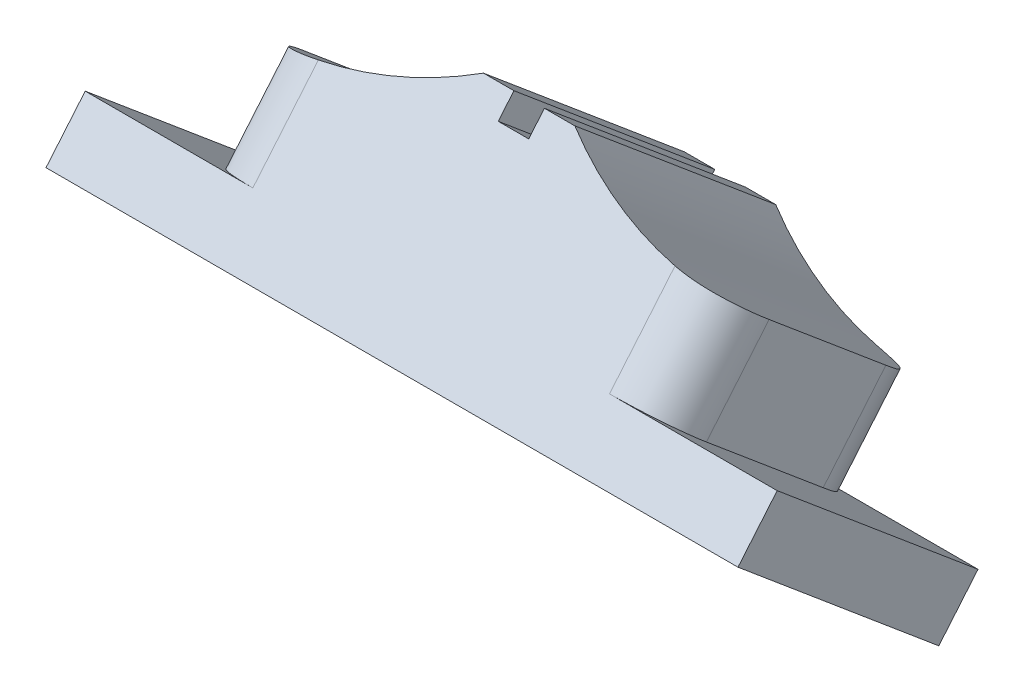
ISO-10303-21;
HEADER;
FILE_DESCRIPTION(('STEP AP214'),'2;1');
FILE_NAME('part.step','',(''),(''),'','','');
FILE_SCHEMA(('AUTOMOTIVE_DESIGN { 1 0 10303 214 1 1 1 1 }'));
ENDSEC;
DATA;
#1=APPLICATION_CONTEXT('core data for automotive mechanical design processes');
#2=APPLICATION_PROTOCOL_DEFINITION('international standard','automotive_design',2000,#1);
#3=PRODUCT_CONTEXT('',#1,'mechanical');
#4=PRODUCT('Part','Part','',(#3));
#5=PRODUCT_RELATED_PRODUCT_CATEGORY('part','',(#4));
#6=PRODUCT_DEFINITION_FORMATION('','',#4);
#7=PRODUCT_DEFINITION_CONTEXT('part definition',#1,'design');
#8=PRODUCT_DEFINITION('design','',#6,#7);
#9=PRODUCT_DEFINITION_SHAPE('','',#8);
#10=(LENGTH_UNIT() NAMED_UNIT(*) SI_UNIT(.MILLI.,.METRE.));
#11=(NAMED_UNIT(*) PLANE_ANGLE_UNIT() SI_UNIT($,.RADIAN.));
#12=(NAMED_UNIT(*) SI_UNIT($,.STERADIAN.) SOLID_ANGLE_UNIT());
#13=UNCERTAINTY_MEASURE_WITH_UNIT(LENGTH_MEASURE(1.E-05),#10,'distance_accuracy_value','');
#14=(GEOMETRIC_REPRESENTATION_CONTEXT(3) GLOBAL_UNCERTAINTY_ASSIGNED_CONTEXT((#13)) GLOBAL_UNIT_ASSIGNED_CONTEXT((#10,
#11,#12)) REPRESENTATION_CONTEXT('',''));
#15=CARTESIAN_POINT('',(0.,0.,0.));
#16=DIRECTION('',(0.,0.,1.));
#17=DIRECTION('',(1.,0.,0.));
#18=AXIS2_PLACEMENT_3D('',#15,#16,#17);
#19=CARTESIAN_POINT('',(27.,-212.433524015321,-13.4302925179041));
#20=DIRECTION('',(0.,-0.766044443118977,0.64278760968654));
#21=DIRECTION('',(0.,-0.64278760968654,-0.766044443118977));
#22=AXIS2_PLACEMENT_3D('',#19,#20,#21);
#23=PLANE('',#22);
#24=DIRECTION('',(0.,-0.642787609686541,-0.766044443118977));
#25=VECTOR('',#24,1.);
#26=CARTESIAN_POINT('',(-0.25,-217.403424112797,-19.3531888139056));
#27=LINE('',#26,#25);
#28=CARTESIAN_POINT('',(-0.25,-219.619001888255,-21.9936115874796));
#29=VERTEX_POINT('',#28);
#30=CARTESIAN_POINT('',(-0.25,-225.146975331559,-28.5815937983029));
#31=VERTEX_POINT('',#30);
#32=EDGE_CURVE('E63',#29,#31,#27,.T.);
#33=ORIENTED_EDGE('',*,*,#32,.F.);
#34=DIRECTION('',(-1.,0.,0.));
#35=VECTOR('',#34,1.);
#36=CARTESIAN_POINT('',(7.1,-219.619001888255,-21.9936115874797));
#37=LINE('',#36,#35);
#38=CARTESIAN_POINT('',(0.749999999999999,-219.619001888255,-21.9936115874796));
#39=VERTEX_POINT('',#38);
#40=EDGE_CURVE('E362',#39,#29,#37,.T.);
#41=ORIENTED_EDGE('',*,*,#40,.F.);
#42=DIRECTION('',(0.,-0.642787609686541,-0.766044443118977));
#43=VECTOR('',#42,1.);
#44=CARTESIAN_POINT('',(0.75,-217.403424112797,-19.3531888139056));
#45=LINE('',#44,#43);
#46=CARTESIAN_POINT('',(0.75,-225.146975331559,-28.5815937983029));
#47=VERTEX_POINT('',#46);
#48=EDGE_CURVE('E238',#39,#47,#45,.T.);
#49=ORIENTED_EDGE('',*,*,#48,.T.);
#50=DIRECTION('',(1.,0.,0.));
#51=VECTOR('',#50,1.);
#52=CARTESIAN_POINT('',(7.1,-225.146975331559,-28.5815937983029));
#53=LINE('',#52,#51);
#54=EDGE_CURVE('E358',#31,#47,#53,.T.);
#55=ORIENTED_EDGE('',*,*,#54,.F.);
#56=EDGE_LOOP('',(#33,#41,#49,#55));
#57=FACE_BOUND('',#56,.T.);
#58=ADVANCED_FACE('F39',(#57),#23,.F.);
#59=CARTESIAN_POINT('',(7.1,-203.875751952295,-35.2037668022753));
#60=DIRECTION('',(0.,-0.642787609686541,-0.766044443118977));
#61=DIRECTION('',(0.,0.766044443118977,-0.642787609686541));
#62=AXIS2_PLACEMENT_3D('',#59,#60,#61);
#63=PLANE('',#62);
#64=CARTESIAN_POINT('',(-6.4,-212.260187456543,-28.168390063031));
#65=DIRECTION('',(0.,-0.642787609686541,-0.766044443118977));
#66=DIRECTION('',(0.,0.766044443118977,-0.642787609686541));
#67=AXIS2_PLACEMENT_3D('',#64,#65,#66);
#68=CIRCLE('',#67,11.40625);
#69=CARTESIAN_POINT('',(-4.6,-220.888396650371,-20.9284629107698));
#70=VERTEX_POINT('',#69);
#71=EDGE_CURVE('E405',#70,#29,#68,.F.);
#72=ORIENTED_EDGE('',*,*,#71,.F.);
#73=DIRECTION('',(0.,-0.766044443118977,0.642787609686541));
#74=VECTOR('',#73,1.);
#75=CARTESIAN_POINT('',(-4.6,-203.875751952295,-35.2037668022753));
#76=LINE('',#75,#74);
#77=CARTESIAN_POINT('',(-4.6,-223.44922410385,-18.7796735390474));
#78=VERTEX_POINT('',#77);
#79=EDGE_CURVE('E388',#70,#78,#76,.T.);
#80=ORIENTED_EDGE('',*,*,#79,.T.);
#81=DIRECTION('',(-1.,0.,0.));
#82=VECTOR('',#81,1.);
#83=CARTESIAN_POINT('',(12.6,-223.44922410385,-18.7796735390474));
#84=LINE('',#83,#82);
#85=CARTESIAN_POINT('',(-10.1,-223.44922410385,-18.7796735390474));
#86=VERTEX_POINT('',#85);
#87=EDGE_CURVE('E423',#78,#86,#84,.T.);
#88=ORIENTED_EDGE('',*,*,#87,.T.);
#89=DIRECTION('',(0.,0.766044443118977,-0.642787609686541));
#90=VECTOR('',#89,1.);
#91=CARTESIAN_POINT('',(-10.1,-224.981312990088,-17.4940983196743));
#92=LINE('',#91,#90);
#93=CARTESIAN_POINT('',(-10.1,-224.981312990088,-17.4940983196743));
#94=VERTEX_POINT('',#93);
#95=EDGE_CURVE('E470',#94,#86,#92,.T.);
#96=ORIENTED_EDGE('',*,*,#95,.F.);
#97=DIRECTION('',(-1.,0.,0.));
#98=VECTOR('',#97,1.);
#99=CARTESIAN_POINT('',(12.6,-224.981312990088,-17.4940983196743));
#100=LINE('',#99,#98);
#101=CARTESIAN_POINT('',(12.6,-224.981312990088,-17.4940983196743));
#102=VERTEX_POINT('',#101);
#103=EDGE_CURVE('E483',#102,#94,#100,.T.);
#104=ORIENTED_EDGE('',*,*,#103,.F.);
#105=DIRECTION('',(0.,0.766044443118977,-0.642787609686541));
#106=VECTOR('',#105,1.);
#107=CARTESIAN_POINT('',(12.6,-224.981312990088,-17.4940983196743));
#108=LINE('',#107,#106);
#109=CARTESIAN_POINT('',(12.6,-223.44922410385,-18.7796735390474));
#110=VERTEX_POINT('',#109);
#111=EDGE_CURVE('E366',#102,#110,#108,.T.);
#112=ORIENTED_EDGE('',*,*,#111,.T.);
#113=CARTESIAN_POINT('',(7.1,-223.44922410385,-18.7796735390474));
#114=VERTEX_POINT('',#113);
#115=EDGE_CURVE('E449',#110,#114,#84,.T.);
#116=ORIENTED_EDGE('',*,*,#115,.T.);
#117=DIRECTION('',(0.,-0.766044443118977,0.642787609686541));
#118=VECTOR('',#117,1.);
#119=CARTESIAN_POINT('',(7.1,-203.875751952295,-35.2037668022753));
#120=LINE('',#119,#118);
#121=CARTESIAN_POINT('',(7.1,-220.888396650371,-20.9284629107698));
#122=VERTEX_POINT('',#121);
#123=EDGE_CURVE('E386',#122,#114,#120,.T.);
#124=ORIENTED_EDGE('',*,*,#123,.F.);
#125=CARTESIAN_POINT('',(8.9,-212.260187456543,-28.168390063031));
#126=DIRECTION('',(0.,-0.642787609686541,-0.766044443118977));
#127=DIRECTION('',(0.,0.766044443118977,-0.642787609686541));
#128=AXIS2_PLACEMENT_3D('',#125,#126,#127);
#129=CIRCLE('',#128,11.40625);
#130=CARTESIAN_POINT('',(2.75,-219.619001888255,-21.9936115874797));
#131=VERTEX_POINT('',#130);
#132=EDGE_CURVE('E310',#122,#131,#129,.T.);
#133=ORIENTED_EDGE('',*,*,#132,.T.);
#134=CARTESIAN_POINT('',(1.75,-219.619001888255,-21.9936115874797));
#135=VERTEX_POINT('',#134);
#136=EDGE_CURVE('E359',#131,#135,#37,.T.);
#137=ORIENTED_EDGE('',*,*,#136,.T.);
#138=DIRECTION('',(0.,-0.766044443118977,0.642787609686541));
#139=VECTOR('',#138,1.);
#140=CARTESIAN_POINT('',(1.75,-203.875751952295,-35.2037668022753));
#141=LINE('',#140,#139);
#142=CARTESIAN_POINT('',(1.75,-220.23183744275,-21.4793814997304));
#143=VERTEX_POINT('',#142);
#144=EDGE_CURVE('E309',#135,#143,#141,.T.);
#145=ORIENTED_EDGE('',*,*,#144,.T.);
#146=DIRECTION('',(-1.,0.,0.));
#147=VECTOR('',#146,1.);
#148=CARTESIAN_POINT('',(7.1,-220.23183744275,-21.4793814997304));
#149=LINE('',#148,#147);
#150=CARTESIAN_POINT('',(0.749999999999999,-220.23183744275,-21.4793814997304));
#151=VERTEX_POINT('',#150);
#152=EDGE_CURVE('E487',#143,#151,#149,.T.);
#153=ORIENTED_EDGE('',*,*,#152,.T.);
#154=DIRECTION('',(0.,-0.766044443118977,0.642787609686541));
#155=VECTOR('',#154,1.);
#156=CARTESIAN_POINT('',(0.750000000000004,-203.875751952295,-35.2037668022753));
#157=LINE('',#156,#155);
#158=EDGE_CURVE('E236',#39,#151,#157,.T.);
#159=ORIENTED_EDGE('',*,*,#158,.F.);
#160=ORIENTED_EDGE('',*,*,#40,.T.);
#161=EDGE_LOOP('',(#72,#80,#88,#96,#104,#112,#116,#124,#133,#137,#145,#153,#159,#160));
#162=FACE_BOUND('',#161,.T.);
#163=ADVANCED_FACE('F328',(#162),#63,.F.);
#164=CARTESIAN_POINT('',(-4.6,-205.032769649731,-36.5826467998895));
#165=DIRECTION('',(0.,-0.766044443118977,0.642787609686541));
#166=DIRECTION('',(0.,-0.642787609686541,-0.766044443118977));
#167=AXIS2_PLACEMENT_3D('',#164,#165,#166);
#168=CYLINDRICAL_SURFACE('',#167,1.79999999999999);
#169=CARTESIAN_POINT('',(-6.39999999999999,-222.154899583305,-22.215473887658));
#170=CARTESIAN_POINT('',(-6.39999966162086,-222.122353709626,-22.1766902455585));
#171=CARTESIAN_POINT('',(-6.39786248934707,-222.089826566027,-22.1379225460177));
#172=CARTESIAN_POINT('',(-6.38933642219922,-222.02499850881,-22.0606697423791));
#173=CARTESIAN_POINT('',(-6.38294772680934,-221.99269758465,-22.0221846251079));
#174=CARTESIAN_POINT('',(-6.35746428264791,-221.896515770289,-21.907646470184));
#175=CARTESIAN_POINT('',(-6.33205201265783,-221.833250102125,-21.832384462603));
#176=CARTESIAN_POINT('',(-6.26508538130227,-221.710034567167,-21.6864701803497));
#177=CARTESIAN_POINT('',(-6.22352305103209,-221.650086354011,-21.6158202015174));
#178=CARTESIAN_POINT('',(-6.12544362686748,-221.534819656705,-21.4814693955804));
#179=CARTESIAN_POINT('',(-6.06892911062745,-221.47950037672,-21.4177673733662));
#180=CARTESIAN_POINT('',(-5.94263351426813,-221.37464149739,-21.2995984206337));
#181=CARTESIAN_POINT('',(-5.87286642515245,-221.325095890874,-21.2451218643136));
#182=CARTESIAN_POINT('',(-5.72204315844291,-221.232601873031,-21.1473060252902));
#183=CARTESIAN_POINT('',(-5.6409859507835,-221.189654064413,-21.103967759828));
#184=CARTESIAN_POINT('',(-5.47034903749162,-221.111245972975,-21.0302344794521));
#185=CARTESIAN_POINT('',(-5.3808063809634,-221.075755135881,-20.9997861069426));
#186=CARTESIAN_POINT('',(-5.19555154878798,-221.012589728072,-20.952738623383));
#187=CARTESIAN_POINT('',(-5.0998419449059,-220.984911924717,-20.9361337790046));
#188=CARTESIAN_POINT('',(-4.93632166219124,-220.945330285694,-20.9203656894631));
#189=CARTESIAN_POINT('',(-4.86938464779866,-220.931213025648,-20.9173213344002));
#190=CARTESIAN_POINT('',(-4.73493889953039,-220.906876662016,-20.9179043263069));
#191=CARTESIAN_POINT('',(-4.66743118949004,-220.896651665,-20.9215215378582));
#192=CARTESIAN_POINT('',(-4.6,-220.888396650371,-20.9284629107698));
#193=B_SPLINE_CURVE_WITH_KNOTS('',3,(#169,#170,#171,#172,#173,#174,#175,#176,#177,#178,#179,
#180,#181,#182,#183,#184,#185,#186,#187,#188,#189,#190,#191,#192),.UNSPECIFIED.,.F.,.F.,(4,2,2,
2,2,2,2,2,2,2,2,4),(0.,0.151796967185068,0.303586812461919,0.606678939947741,0.909920812115097,
1.21311044148627,1.51598174883098,1.81888070707245,2.12051325798589,2.42202082495577,
2.62704003185086,2.83174756447131),.UNSPECIFIED.);
#194=CARTESIAN_POINT('',(-6.4,-222.154899583305,-22.215473887658));
#195=VERTEX_POINT('',#194);
#196=EDGE_CURVE('E253',#195,#70,#193,.T.);
#197=ORIENTED_EDGE('',*,*,#196,.F.);
#198=DIRECTION('',(0.,-0.766044443118977,0.642787609686541));
#199=VECTOR('',#198,1.);
#200=CARTESIAN_POINT('',(-6.4,-205.032769649731,-36.5826467998895));
#201=LINE('',#200,#199);
#202=CARTESIAN_POINT('',(-6.4,-224.606241801286,-20.1585535366612));
#203=VERTEX_POINT('',#202);
#204=EDGE_CURVE('E390',#195,#203,#201,.T.);
#205=ORIENTED_EDGE('',*,*,#204,.T.);
#206=CARTESIAN_POINT('',(-4.6,-224.606241801286,-20.1585535366612));
#207=DIRECTION('',(0.,0.766044443118977,-0.642787609686541));
#208=DIRECTION('',(0.,0.642787609686541,0.766044443118977));
#209=AXIS2_PLACEMENT_3D('',#206,#207,#208);
#210=CIRCLE('',#209,1.79999999999999);
#211=EDGE_CURVE('E383',#203,#78,#210,.T.);
#212=ORIENTED_EDGE('',*,*,#211,.T.);
#213=ORIENTED_EDGE('',*,*,#79,.F.);
#214=EDGE_LOOP('',(#197,#205,#212,#213));
#215=FACE_BOUND('',#214,.T.);
#216=ADVANCED_FACE('F336',(#215),#168,.T.);
#217=CARTESIAN_POINT('',(-6.4,-208.246707698164,-40.4128690154845));
#218=DIRECTION('',(1.,0.,0.));
#219=DIRECTION('',(0.,0.,-1.));
#220=AXIS2_PLACEMENT_3D('',#217,#218,#219);
#221=PLANE('',#220);
#222=DIRECTION('',(0.,-0.642787609686541,-0.766044443118977));
#223=VECTOR('',#222,1.);
#224=CARTESIAN_POINT('',(-6.4,-218.782304110411,-18.1961711164699));
#225=LINE('',#224,#223);
#226=CARTESIAN_POINT('',(-6.4,-225.368837631738,-26.045696103253));
#227=VERTEX_POINT('',#226);
#228=EDGE_CURVE('E233',#195,#227,#225,.T.);
#229=ORIENTED_EDGE('',*,*,#228,.T.);
#230=DIRECTION('',(0.,-0.766044443118977,0.642787609686541));
#231=VECTOR('',#230,1.);
#232=CARTESIAN_POINT('',(-6.39999999999999,-208.246707698164,-40.4128690154845));
#233=LINE('',#232,#231);
#234=CARTESIAN_POINT('',(-6.39999999999999,-227.820179849718,-23.9887757522562));
#235=VERTEX_POINT('',#234);
#236=EDGE_CURVE('E392',#227,#235,#233,.T.);
#237=ORIENTED_EDGE('',*,*,#236,.T.);
#238=DIRECTION('',(0.,0.642787609686542,0.766044443118976));
#239=VECTOR('',#238,1.);
#240=CARTESIAN_POINT('',(-6.4,-227.820179849718,-23.9887757522562));
#241=LINE('',#240,#239);
#242=EDGE_CURVE('E380',#235,#203,#241,.T.);
#243=ORIENTED_EDGE('',*,*,#242,.T.);
#244=ORIENTED_EDGE('',*,*,#204,.F.);
#245=EDGE_LOOP('',(#229,#237,#243,#244));
#246=FACE_BOUND('',#245,.T.);
#247=ADVANCED_FACE('F417',(#246),#221,.F.);
#248=CARTESIAN_POINT('',(-4.6,-208.246707698164,-40.4128690154845));
#249=DIRECTION('',(0.,-0.766044443118977,0.642787609686541));
#250=DIRECTION('',(0.,-0.642787609686541,-0.766044443118977));
#251=AXIS2_PLACEMENT_3D('',#248,#249,#250);
#252=CYLINDRICAL_SURFACE('',#251,1.79999999999999);
#253=CARTESIAN_POINT('',(-4.6,-226.416370093675,-27.516445121593));
#254=CARTESIAN_POINT('',(-4.64994826080426,-226.422486052998,-27.5113128102879));
#255=CARTESIAN_POINT('',(-4.69992818860471,-226.42700484587,-27.5048056339949));
#256=CARTESIAN_POINT('',(-4.79964525844471,-226.432822165645,-27.4890565767436));
#257=CARTESIAN_POINT('',(-4.84938239260366,-226.434120588704,-27.4798146076112));
#258=CARTESIAN_POINT('',(-4.99761875118883,-226.433146926838,-27.4480411449811));
#259=CARTESIAN_POINT('',(-5.09529300113693,-226.426024203381,-27.4214467612742));
#260=CARTESIAN_POINT('',(-5.28541952564419,-226.399139247986,-27.3578555956856));
#261=CARTESIAN_POINT('',(-5.3778671704631,-226.379365995345,-27.3208497594708));
#262=CARTESIAN_POINT('',(-5.5547340172246,-226.328070358171,-27.2371181658142));
#263=CARTESIAN_POINT('',(-5.63915564856285,-226.296551543208,-27.1903953633398));
#264=CARTESIAN_POINT('',(-5.79696732163634,-226.223362685721,-27.0884711713953));
#265=CARTESIAN_POINT('',(-5.87042528313845,-226.18175972535,-27.0333266667633));
#266=CARTESIAN_POINT('',(-6.00486217275486,-226.089968725154,-26.9154479425604));
#267=CARTESIAN_POINT('',(-6.06583805102167,-226.039778592643,-26.8527118740257));
#268=CARTESIAN_POINT('',(-6.17370815572414,-225.932578944369,-26.7208294690174));
#269=CARTESIAN_POINT('',(-6.22056058967509,-225.875549874274,-26.6516648849517));
#270=CARTESIAN_POINT('',(-6.29860056915496,-225.756831632501,-26.5086861327525));
#271=CARTESIAN_POINT('',(-6.32979633281895,-225.695144925205,-26.4348744268256));
#272=CARTESIAN_POINT('',(-6.36843264545957,-225.589064888362,-26.308203737747));
#273=CARTESIAN_POINT('',(-6.38026134891348,-225.545348492658,-26.2560727405979));
#274=CARTESIAN_POINT('',(-6.39604536779249,-225.457369050863,-26.151203692914));
#275=CARTESIAN_POINT('',(-6.40001100057624,-225.413106797889,-26.0984665293119));
#276=CARTESIAN_POINT('',(-6.39999999999999,-225.368837631738,-26.045696103253));
#277=B_SPLINE_CURVE_WITH_KNOTS('',3,(#253,#254,#255,#256,#257,#258,#259,#260,#261,#262,#263,
#264,#265,#266,#267,#268,#269,#270,#271,#272,#273,#274,#275,#276),.UNSPECIFIED.,.F.,.F.,(4,2,2,
2,2,2,2,2,2,2,2,4),(0.,0.15165762873199,0.303320147680413,0.606195069857615,0.909334206121151,
1.21238129103091,1.51346524181524,1.81462267127661,2.11666269584407,2.41854401434521,
2.62528397403094,2.83175248434783),.UNSPECIFIED.);
#278=CARTESIAN_POINT('',(-4.6,-226.416370093675,-27.5164451215931));
#279=VERTEX_POINT('',#278);
#280=EDGE_CURVE('E245',#279,#227,#277,.T.);
#281=ORIENTED_EDGE('',*,*,#280,.F.);
#282=DIRECTION('',(0.,-0.766044443118977,0.642787609686541));
#283=VECTOR('',#282,1.);
#284=CARTESIAN_POINT('',(-4.6,-209.4037253956,-41.7917490130986));
#285=LINE('',#284,#283);
#286=CARTESIAN_POINT('',(-4.6,-228.977197547154,-25.3676557498701));
#287=VERTEX_POINT('',#286);
#288=EDGE_CURVE('E394',#279,#287,#285,.T.);
#289=ORIENTED_EDGE('',*,*,#288,.T.);
#290=CARTESIAN_POINT('',(-4.6,-227.820179849718,-23.9887757522562));
#291=DIRECTION('',(0.,0.766044443118977,-0.642787609686541));
#292=DIRECTION('',(0.,0.642787609686541,0.766044443118977));
#293=AXIS2_PLACEMENT_3D('',#290,#291,#292);
#294=CIRCLE('',#293,1.79999999999999);
#295=EDGE_CURVE('E377',#287,#235,#294,.T.);
#296=ORIENTED_EDGE('',*,*,#295,.T.);
#297=ORIENTED_EDGE('',*,*,#236,.F.);
#298=EDGE_LOOP('',(#281,#289,#296,#297));
#299=FACE_BOUND('',#298,.T.);
#300=ADVANCED_FACE('F260',(#299),#252,.T.);
#301=CARTESIAN_POINT('',(7.1,-209.4037253956,-41.7917490130986));
#302=DIRECTION('',(0.,0.642787609686541,0.766044443118977));
#303=DIRECTION('',(0.,-0.766044443118977,0.642787609686541));
#304=AXIS2_PLACEMENT_3D('',#301,#302,#303);
#305=PLANE('',#304);
#306=CARTESIAN_POINT('',(-6.4,-217.788160899848,-34.7563722738543));
#307=DIRECTION('',(0.,0.642787609686541,0.766044443118977));
#308=DIRECTION('',(0.,-0.766044443118977,0.642787609686541));
#309=AXIS2_PLACEMENT_3D('',#306,#307,#308);
#310=CIRCLE('',#309,11.40625);
#311=EDGE_CURVE('E230',#279,#31,#310,.T.);
#312=ORIENTED_EDGE('',*,*,#311,.T.);
#313=ORIENTED_EDGE('',*,*,#54,.T.);
#314=DIRECTION('',(0.,-0.766044443118977,0.64278760968654));
#315=VECTOR('',#314,1.);
#316=CARTESIAN_POINT('',(0.749999999999999,-225.759810886055,-28.0673637105537));
#317=LINE('',#316,#315);
#318=CARTESIAN_POINT('',(0.749999999999999,-225.759810886055,-28.0673637105537));
#319=VERTEX_POINT('',#318);
#320=EDGE_CURVE('E224',#47,#319,#317,.T.);
#321=ORIENTED_EDGE('',*,*,#320,.T.);
#322=DIRECTION('',(-1.,0.,0.));
#323=VECTOR('',#322,1.);
#324=CARTESIAN_POINT('',(1.25,-225.759810886055,-28.0673637105537));
#325=LINE('',#324,#323);
#326=CARTESIAN_POINT('',(1.75,-225.759810886055,-28.0673637105537));
#327=VERTEX_POINT('',#326);
#328=EDGE_CURVE('E432',#327,#319,#325,.T.);
#329=ORIENTED_EDGE('',*,*,#328,.F.);
#330=DIRECTION('',(0.,-0.766044443118977,0.64278760968654));
#331=VECTOR('',#330,1.);
#332=CARTESIAN_POINT('',(1.75,-225.759810886055,-28.0673637105537));
#333=LINE('',#332,#331);
#334=CARTESIAN_POINT('',(1.75,-225.146975331559,-28.5815937983029));
#335=VERTEX_POINT('',#334);
#336=EDGE_CURVE('E427',#335,#327,#333,.T.);
#337=ORIENTED_EDGE('',*,*,#336,.F.);
#338=CARTESIAN_POINT('',(2.74999999999993,-225.146975331559,-28.5815937983029));
#339=VERTEX_POINT('',#338);
#340=EDGE_CURVE('E352',#335,#339,#53,.T.);
#341=ORIENTED_EDGE('',*,*,#340,.T.);
#342=CARTESIAN_POINT('',(8.9,-217.788160899848,-34.7563722738543));
#343=DIRECTION('',(0.,-0.642787609686541,-0.766044443118977));
#344=DIRECTION('',(0.,-0.766044443118977,0.642787609686541));
#345=AXIS2_PLACEMENT_3D('',#342,#343,#344);
#346=CIRCLE('',#345,11.40625);
#347=CARTESIAN_POINT('',(7.1,-226.416370093675,-27.5164451215931));
#348=VERTEX_POINT('',#347);
#349=EDGE_CURVE('E426',#348,#339,#346,.T.);
#350=ORIENTED_EDGE('',*,*,#349,.F.);
#351=DIRECTION('',(0.,-0.766044443118977,0.642787609686541));
#352=VECTOR('',#351,1.);
#353=CARTESIAN_POINT('',(7.1,-209.4037253956,-41.7917490130986));
#354=LINE('',#353,#352);
#355=CARTESIAN_POINT('',(7.1,-228.977197547154,-25.3676557498701));
#356=VERTEX_POINT('',#355);
#357=EDGE_CURVE('E396',#348,#356,#354,.T.);
#358=ORIENTED_EDGE('',*,*,#357,.T.);
#359=DIRECTION('',(1.,0.,0.));
#360=VECTOR('',#359,1.);
#361=CARTESIAN_POINT('',(12.6,-228.977197547154,-25.3676557498701));
#362=LINE('',#361,#360);
#363=CARTESIAN_POINT('',(12.6,-228.977197547154,-25.3676557498701));
#364=VERTEX_POINT('',#363);
#365=EDGE_CURVE('E455',#356,#364,#362,.T.);
#366=ORIENTED_EDGE('',*,*,#365,.T.);
#367=DIRECTION('',(0.,0.766044443118977,-0.642787609686541));
#368=VECTOR('',#367,1.);
#369=CARTESIAN_POINT('',(12.6,-230.509286433392,-24.082080530497));
#370=LINE('',#369,#368);
#371=CARTESIAN_POINT('',(12.6,-230.509286433392,-24.082080530497));
#372=VERTEX_POINT('',#371);
#373=EDGE_CURVE('E464',#372,#364,#370,.T.);
#374=ORIENTED_EDGE('',*,*,#373,.F.);
#375=DIRECTION('',(1.,0.,0.));
#376=VECTOR('',#375,1.);
#377=CARTESIAN_POINT('',(12.6,-230.509286433392,-24.082080530497));
#378=LINE('',#377,#376);
#379=CARTESIAN_POINT('',(-10.1,-230.509286433392,-24.082080530497));
#380=VERTEX_POINT('',#379);
#381=EDGE_CURVE('E468',#380,#372,#378,.T.);
#382=ORIENTED_EDGE('',*,*,#381,.F.);
#383=DIRECTION('',(0.,0.766044443118977,-0.642787609686541));
#384=VECTOR('',#383,1.);
#385=CARTESIAN_POINT('',(-10.1,-230.509286433392,-24.082080530497));
#386=LINE('',#385,#384);
#387=CARTESIAN_POINT('',(-10.1,-228.977197547154,-25.3676557498701));
#388=VERTEX_POINT('',#387);
#389=EDGE_CURVE('E467',#380,#388,#386,.T.);
#390=ORIENTED_EDGE('',*,*,#389,.T.);
#391=EDGE_CURVE('E461',#388,#287,#362,.T.);
#392=ORIENTED_EDGE('',*,*,#391,.T.);
#393=ORIENTED_EDGE('',*,*,#288,.F.);
#394=EDGE_LOOP('',(#312,#313,#321,#329,#337,#341,#350,#358,#366,#374,#382,#390,#392,#393));
#395=FACE_BOUND('',#394,.T.);
#396=ADVANCED_FACE('F316',(#395),#305,.F.);
#397=CARTESIAN_POINT('',(7.1,-208.246707698164,-40.4128690154845));
#398=DIRECTION('',(0.,-0.766044443118977,0.642787609686541));
#399=DIRECTION('',(0.,-0.642787609686541,-0.766044443118977));
#400=AXIS2_PLACEMENT_3D('',#397,#398,#399);
#401=CYLINDRICAL_SURFACE('',#400,1.79999999999999);
#402=ORIENTED_EDGE('',*,*,#357,.F.);
#403=CARTESIAN_POINT('',(7.1,-226.416370093675,-27.516445121593));
#404=CARTESIAN_POINT('',(7.14994826080426,-226.422486052998,-27.5113128102879));
#405=CARTESIAN_POINT('',(7.19992818860471,-226.42700484587,-27.5048056339949));
#406=CARTESIAN_POINT('',(7.29964525844471,-226.432822165645,-27.4890565767436));
#407=CARTESIAN_POINT('',(7.34938239260366,-226.434120588704,-27.4798146076112));
#408=CARTESIAN_POINT('',(7.49761875118884,-226.433146926838,-27.4480411449811));
#409=CARTESIAN_POINT('',(7.59529300113693,-226.426024203381,-27.4214467612742));
#410=CARTESIAN_POINT('',(7.78541952564418,-226.399139247986,-27.3578555956856));
#411=CARTESIAN_POINT('',(7.8778671704631,-226.379365995345,-27.3208497594708));
#412=CARTESIAN_POINT('',(8.05473401722459,-226.328070358172,-27.2371181658142));
#413=CARTESIAN_POINT('',(8.13915564856285,-226.296551543208,-27.1903953633398));
#414=CARTESIAN_POINT('',(8.29696732163634,-226.223362685721,-27.0884711713953));
#415=CARTESIAN_POINT('',(8.37042528313845,-226.18175972535,-27.0333266667633));
#416=CARTESIAN_POINT('',(8.50486217275486,-226.089968725154,-26.9154479425604));
#417=CARTESIAN_POINT('',(8.56583805102167,-226.039778592643,-26.8527118740257));
#418=CARTESIAN_POINT('',(8.67370815572414,-225.932578944369,-26.7208294690174));
#419=CARTESIAN_POINT('',(8.72056058967509,-225.875549874274,-26.6516648849517));
#420=CARTESIAN_POINT('',(8.79860056915496,-225.756831632501,-26.5086861327525));
#421=CARTESIAN_POINT('',(8.82979633281895,-225.695144925205,-26.4348744268255));
#422=CARTESIAN_POINT('',(8.86843264545957,-225.589064888362,-26.308203737747));
#423=CARTESIAN_POINT('',(8.88026134891347,-225.545348492658,-26.2560727405979));
#424=CARTESIAN_POINT('',(8.89604536779249,-225.457369050863,-26.1512036929141));
#425=CARTESIAN_POINT('',(8.90001100057624,-225.413106797889,-26.0984665293119));
#426=CARTESIAN_POINT('',(8.89999999999999,-225.368837631738,-26.045696103253));
#427=B_SPLINE_CURVE_WITH_KNOTS('',3,(#403,#404,#405,#406,#407,#408,#409,#410,#411,#412,#413,
#414,#415,#416,#417,#418,#419,#420,#421,#422,#423,#424,#425,#426),.UNSPECIFIED.,.F.,.F.,(4,2,2,
2,2,2,2,2,2,2,2,4),(0.,0.151657628731988,0.30332014768041,0.606195069857608,0.909334206121147,
1.2123812910309,1.51346524181524,1.81462267127662,2.11666269584408,2.41854401434519,
2.62528397403091,2.83175248434782),.UNSPECIFIED.);
#428=CARTESIAN_POINT('',(8.9,-225.368837631738,-26.0456961032529));
#429=VERTEX_POINT('',#428);
#430=EDGE_CURVE('E301',#348,#429,#427,.T.);
#431=ORIENTED_EDGE('',*,*,#430,.T.);
#432=DIRECTION('',(0.,-0.766044443118977,0.642787609686541));
#433=VECTOR('',#432,1.);
#434=CARTESIAN_POINT('',(8.9,-208.246707698164,-40.4128690154845));
#435=LINE('',#434,#433);
#436=CARTESIAN_POINT('',(8.9,-227.820179849718,-23.9887757522562));
#437=VERTEX_POINT('',#436);
#438=EDGE_CURVE('E398',#429,#437,#435,.T.);
#439=ORIENTED_EDGE('',*,*,#438,.T.);
#440=CARTESIAN_POINT('',(7.1,-227.820179849718,-23.9887757522562));
#441=DIRECTION('',(0.,0.766044443118977,-0.642787609686541));
#442=DIRECTION('',(0.,0.642787609686541,0.766044443118977));
#443=AXIS2_PLACEMENT_3D('',#440,#441,#442);
#444=CIRCLE('',#443,1.79999999999999);
#445=EDGE_CURVE('E374',#437,#356,#444,.T.);
#446=ORIENTED_EDGE('',*,*,#445,.T.);
#447=EDGE_LOOP('',(#402,#431,#439,#446));
#448=FACE_BOUND('',#447,.T.);
#449=ADVANCED_FACE('F312',(#448),#401,.T.);
#450=CARTESIAN_POINT('',(8.9,-205.032769649731,-36.5826467998895));
#451=DIRECTION('',(-1.,0.,0.));
#452=DIRECTION('',(0.,0.,1.));
#453=AXIS2_PLACEMENT_3D('',#450,#451,#452);
#454=PLANE('',#453);
#455=ORIENTED_EDGE('',*,*,#438,.F.);
#456=DIRECTION('',(0.,-0.642787609686541,-0.766044443118977));
#457=VECTOR('',#456,1.);
#458=CARTESIAN_POINT('',(8.9,-63.2607556152927,167.147193028402));
#459=LINE('',#458,#457);
#460=CARTESIAN_POINT('',(8.9,-222.154899583305,-22.215473887658));
#461=VERTEX_POINT('',#460);
#462=EDGE_CURVE('E434',#461,#429,#459,.T.);
#463=ORIENTED_EDGE('',*,*,#462,.F.);
#464=DIRECTION('',(0.,-0.766044443118977,0.642787609686541));
#465=VECTOR('',#464,1.);
#466=CARTESIAN_POINT('',(8.9,-205.032769649731,-36.5826467998895));
#467=LINE('',#466,#465);
#468=CARTESIAN_POINT('',(8.9,-224.606241801286,-20.1585535366612));
#469=VERTEX_POINT('',#468);
#470=EDGE_CURVE('E400',#461,#469,#467,.T.);
#471=ORIENTED_EDGE('',*,*,#470,.T.);
#472=DIRECTION('',(0.,-0.642787609686542,-0.766044443118976));
#473=VECTOR('',#472,1.);
#474=CARTESIAN_POINT('',(8.9,-224.606241801286,-20.1585535366612));
#475=LINE('',#474,#473);
#476=EDGE_CURVE('E371',#469,#437,#475,.T.);
#477=ORIENTED_EDGE('',*,*,#476,.T.);
#478=EDGE_LOOP('',(#455,#463,#471,#477));
#479=FACE_BOUND('',#478,.T.);
#480=ADVANCED_FACE('F315',(#479),#454,.F.);
#481=CARTESIAN_POINT('',(7.1,-205.032769649731,-36.5826467998895));
#482=DIRECTION('',(0.,-0.766044443118977,0.642787609686541));
#483=DIRECTION('',(0.,-0.642787609686541,-0.766044443118977));
#484=AXIS2_PLACEMENT_3D('',#481,#482,#483);
#485=CYLINDRICAL_SURFACE('',#484,1.79999999999999);
#486=ORIENTED_EDGE('',*,*,#470,.F.);
#487=CARTESIAN_POINT('',(8.89999999999999,-222.154899583305,-22.215473887658));
#488=CARTESIAN_POINT('',(8.89999966162086,-222.122353709626,-22.1766902455585));
#489=CARTESIAN_POINT('',(8.89786248934707,-222.089826566027,-22.1379225460177));
#490=CARTESIAN_POINT('',(8.88933642219923,-222.02499850881,-22.0606697423791));
#491=CARTESIAN_POINT('',(8.88294772680934,-221.99269758465,-22.0221846251079));
#492=CARTESIAN_POINT('',(8.85746428264791,-221.896515770289,-21.907646470184));
#493=CARTESIAN_POINT('',(8.83205201265783,-221.833250102125,-21.832384462603));
#494=CARTESIAN_POINT('',(8.76508538130226,-221.710034567167,-21.6864701803497));
#495=CARTESIAN_POINT('',(8.72352305103208,-221.650086354011,-21.6158202015174));
#496=CARTESIAN_POINT('',(8.62544362686747,-221.534819656705,-21.4814693955804));
#497=CARTESIAN_POINT('',(8.56892911062745,-221.47950037672,-21.4177673733662));
#498=CARTESIAN_POINT('',(8.44263351426813,-221.37464149739,-21.2995984206337));
#499=CARTESIAN_POINT('',(8.37286642515245,-221.325095890874,-21.2451218643136));
#500=CARTESIAN_POINT('',(8.22204315844291,-221.232601873031,-21.1473060252902));
#501=CARTESIAN_POINT('',(8.1409859507835,-221.189654064413,-21.103967759828));
#502=CARTESIAN_POINT('',(7.97034903749162,-221.111245972975,-21.0302344794521));
#503=CARTESIAN_POINT('',(7.8808063809634,-221.075755135881,-20.9997861069426));
#504=CARTESIAN_POINT('',(7.69555154878798,-221.012589728072,-20.952738623383));
#505=CARTESIAN_POINT('',(7.59984194490591,-220.984911924717,-20.9361337790046));
#506=CARTESIAN_POINT('',(7.43632166219124,-220.945330285694,-20.9203656894631));
#507=CARTESIAN_POINT('',(7.36938464779865,-220.931213025648,-20.9173213344002));
#508=CARTESIAN_POINT('',(7.23493889953038,-220.906876662016,-20.9179043263069));
#509=CARTESIAN_POINT('',(7.16743118949004,-220.896651665,-20.9215215378582));
#510=CARTESIAN_POINT('',(7.1,-220.888396650371,-20.9284629107698));
#511=B_SPLINE_CURVE_WITH_KNOTS('',3,(#487,#488,#489,#490,#491,#492,#493,#494,#495,#496,#497,
#498,#499,#500,#501,#502,#503,#504,#505,#506,#507,#508,#509,#510),.UNSPECIFIED.,.F.,.F.,(4,2,2,
2,2,2,2,2,2,2,2,4),(0.,0.151796967185052,0.303586812461924,0.606678939947742,0.9099208121151,
1.21311044148627,1.51598174883098,1.81888070707243,2.12051325798589,2.42202082495577,
2.62704003185086,2.8317475644713),.UNSPECIFIED.);
#512=EDGE_CURVE('E293',#461,#122,#511,.T.);
#513=ORIENTED_EDGE('',*,*,#512,.T.);
#514=ORIENTED_EDGE('',*,*,#123,.T.);
#515=CARTESIAN_POINT('',(7.1,-224.606241801286,-20.1585535366612));
#516=DIRECTION('',(0.,0.766044443118977,-0.642787609686541));
#517=DIRECTION('',(0.,-0.642787609686541,-0.766044443118977));
#518=AXIS2_PLACEMENT_3D('',#515,#516,#517);
#519=CIRCLE('',#518,1.79999999999999);
#520=EDGE_CURVE('E368',#114,#469,#519,.T.);
#521=ORIENTED_EDGE('',*,*,#520,.T.);
#522=EDGE_LOOP('',(#486,#513,#514,#521));
#523=FACE_BOUND('',#522,.T.);
#524=ADVANCED_FACE('F41',(#523),#485,.T.);
#525=ORIENTED_EDGE('',*,*,#340,.F.);
#526=DIRECTION('',(0.,0.64278760968654,0.766044443118977));
#527=VECTOR('',#526,1.);
#528=CARTESIAN_POINT('',(1.75,-212.433524015321,-13.4302925179041));
#529=LINE('',#528,#527);
#530=EDGE_CURVE('E11',#335,#135,#529,.T.);
#531=ORIENTED_EDGE('',*,*,#530,.T.);
#532=ORIENTED_EDGE('',*,*,#136,.F.);
#533=DIRECTION('',(0.,-0.642787609686541,-0.766044443118977));
#534=VECTOR('',#533,1.);
#535=CARTESIAN_POINT('',(2.75000000000026,-61.8818756176786,165.990175330966));
#536=LINE('',#535,#534);
#537=EDGE_CURVE('E48',#131,#339,#536,.T.);
#538=ORIENTED_EDGE('',*,*,#537,.T.);
#539=EDGE_LOOP('',(#525,#531,#532,#538));
#540=FACE_BOUND('',#539,.T.);
#541=ADVANCED_FACE('F324',(#540),#23,.F.);
#542=CARTESIAN_POINT('',(0.,-121.87820328514,102.267955425111));
#543=DIRECTION('',(0.,0.766044443118977,-0.64278760968654));
#544=DIRECTION('',(0.,0.64278760968654,0.766044443118977));
#545=AXIS2_PLACEMENT_3D('',#542,#543,#544);
#546=PLANE('',#545);
#547=ORIENTED_EDGE('',*,*,#211,.F.);
#548=ORIENTED_EDGE('',*,*,#242,.F.);
#549=ORIENTED_EDGE('',*,*,#295,.F.);
#550=ORIENTED_EDGE('',*,*,#391,.F.);
#551=DIRECTION('',(0.,-0.64278760968654,-0.766044443118977));
#552=VECTOR('',#551,1.);
#553=CARTESIAN_POINT('',(-10.1,-223.44922410385,-18.7796735390474));
#554=LINE('',#553,#552);
#555=EDGE_CURVE('E453',#86,#388,#554,.T.);
#556=ORIENTED_EDGE('',*,*,#555,.F.);
#557=ORIENTED_EDGE('',*,*,#87,.F.);
#558=EDGE_LOOP('',(#547,#548,#549,#550,#556,#557));
#559=FACE_BOUND('',#558,.T.);
#560=ADVANCED_FACE('F341',(#559),#546,.T.);
#561=CARTESIAN_POINT('',(12.6,-224.981312990088,-17.4940983196743));
#562=DIRECTION('',(-1.,0.,0.));
#563=DIRECTION('',(0.,0.,1.));
#564=AXIS2_PLACEMENT_3D('',#561,#562,#563);
#565=PLANE('',#564);
#566=DIRECTION('',(0.,0.64278760968654,0.766044443118977));
#567=VECTOR('',#566,1.);
#568=CARTESIAN_POINT('',(12.6,-223.44922410385,-18.7796735390474));
#569=LINE('',#568,#567);
#570=EDGE_CURVE('E457',#364,#110,#569,.T.);
#571=ORIENTED_EDGE('',*,*,#570,.T.);
#572=ORIENTED_EDGE('',*,*,#111,.F.);
#573=DIRECTION('',(0.,0.64278760968654,0.766044443118977));
#574=VECTOR('',#573,1.);
#575=CARTESIAN_POINT('',(12.6,-224.981312990088,-17.4940983196743));
#576=LINE('',#575,#574);
#577=EDGE_CURVE('E463',#372,#102,#576,.T.);
#578=ORIENTED_EDGE('',*,*,#577,.F.);
#579=ORIENTED_EDGE('',*,*,#373,.T.);
#580=EDGE_LOOP('',(#571,#572,#578,#579));
#581=FACE_BOUND('',#580,.T.);
#582=ADVANCED_FACE('F347',(#581),#565,.F.);
#583=CARTESIAN_POINT('',(-10.1,-224.981312990088,-17.4940983196743));
#584=DIRECTION('',(1.,0.,0.));
#585=DIRECTION('',(0.,0.,-1.));
#586=AXIS2_PLACEMENT_3D('',#583,#584,#585);
#587=PLANE('',#586);
#588=ORIENTED_EDGE('',*,*,#555,.T.);
#589=ORIENTED_EDGE('',*,*,#389,.F.);
#590=DIRECTION('',(0.,-0.64278760968654,-0.766044443118977));
#591=VECTOR('',#590,1.);
#592=CARTESIAN_POINT('',(-10.1,-224.981312990088,-17.4940983196743));
#593=LINE('',#592,#591);
#594=EDGE_CURVE('E477',#94,#380,#593,.T.);
#595=ORIENTED_EDGE('',*,*,#594,.F.);
#596=ORIENTED_EDGE('',*,*,#95,.T.);
#597=EDGE_LOOP('',(#588,#589,#595,#596));
#598=FACE_BOUND('',#597,.T.);
#599=ADVANCED_FACE('F475',(#598),#587,.F.);
#600=CARTESIAN_POINT('',(0.,-123.410292171378,103.553530644484));
#601=DIRECTION('',(0.,0.766044443118977,-0.64278760968654));
#602=DIRECTION('',(0.,0.64278760968654,0.766044443118977));
#603=AXIS2_PLACEMENT_3D('',#600,#601,#602);
#604=PLANE('',#603);
#605=DIRECTION('',(-1.,0.,0.));
#606=VECTOR('',#605,1.);
#607=CARTESIAN_POINT('',(-0.799999999999998,-226.427585111883,-19.2176983166916));
#608=LINE('',#607,#606);
#609=CARTESIAN_POINT('',(3.3,-226.427585111882,-19.2176983166917));
#610=VERTEX_POINT('',#609);
#611=CARTESIAN_POINT('',(-0.799999999999998,-226.427585111883,-19.2176983166916));
#612=VERTEX_POINT('',#611);
#613=EDGE_CURVE('E218',#610,#612,#608,.T.);
#614=ORIENTED_EDGE('',*,*,#613,.F.);
#615=DIRECTION('',(0.,0.642787609686542,0.766044443118976));
#616=VECTOR('',#615,1.);
#617=CARTESIAN_POINT('',(3.3,-226.427585111883,-19.2176983166916));
#618=LINE('',#617,#616);
#619=CARTESIAN_POINT('',(3.3,-229.063014311597,-22.3584805334794));
#620=VERTEX_POINT('',#619);
#621=EDGE_CURVE('E55',#620,#610,#618,.T.);
#622=ORIENTED_EDGE('',*,*,#621,.F.);
#623=DIRECTION('',(1.,0.,0.));
#624=VECTOR('',#623,1.);
#625=CARTESIAN_POINT('',(-0.799999999999997,-229.063014311597,-22.3584805334794));
#626=LINE('',#625,#624);
#627=CARTESIAN_POINT('',(-0.799999999999997,-229.063014311597,-22.3584805334794));
#628=VERTEX_POINT('',#627);
#629=EDGE_CURVE('E209',#628,#620,#626,.T.);
#630=ORIENTED_EDGE('',*,*,#629,.F.);
#631=DIRECTION('',(0.,-0.642787609686542,-0.766044443118976));
#632=VECTOR('',#631,1.);
#633=CARTESIAN_POINT('',(-0.799999999999998,-226.427585111883,-19.2176983166916));
#634=LINE('',#633,#632);
#635=EDGE_CURVE('E212',#612,#628,#634,.T.);
#636=ORIENTED_EDGE('',*,*,#635,.F.);
#637=EDGE_LOOP('',(#614,#622,#630,#636));
#638=FACE_BOUND('',#637,.T.);
#639=ORIENTED_EDGE('',*,*,#577,.T.);
#640=ORIENTED_EDGE('',*,*,#103,.T.);
#641=ORIENTED_EDGE('',*,*,#594,.T.);
#642=ORIENTED_EDGE('',*,*,#381,.T.);
#643=EDGE_LOOP('',(#639,#640,#641,#642));
#644=FACE_BOUND('',#643,.T.);
#645=ADVANCED_FACE('F289',(#638,#644),#604,.F.);
#646=ORIENTED_EDGE('',*,*,#445,.F.);
#647=ORIENTED_EDGE('',*,*,#476,.F.);
#648=ORIENTED_EDGE('',*,*,#520,.F.);
#649=ORIENTED_EDGE('',*,*,#115,.F.);
#650=ORIENTED_EDGE('',*,*,#570,.F.);
#651=ORIENTED_EDGE('',*,*,#365,.F.);
#652=EDGE_LOOP('',(#646,#647,#648,#649,#650,#651));
#653=FACE_BOUND('',#652,.T.);
#654=ADVANCED_FACE('F287',(#653),#546,.T.);
#655=CARTESIAN_POINT('',(8.9,-54.5230611859668,159.815396855415));
#656=DIRECTION('',(0.,-0.642787609686541,-0.766044443118977));
#657=DIRECTION('',(0.,0.766044443118977,-0.642787609686541));
#658=AXIS2_PLACEMENT_3D('',#655,#656,#657);
#659=CYLINDRICAL_SURFACE('',#658,11.40625);
#660=ORIENTED_EDGE('',*,*,#349,.T.);
#661=ORIENTED_EDGE('',*,*,#537,.F.);
#662=ORIENTED_EDGE('',*,*,#132,.F.);
#663=ORIENTED_EDGE('',*,*,#512,.F.);
#664=ORIENTED_EDGE('',*,*,#462,.T.);
#665=ORIENTED_EDGE('',*,*,#430,.F.);
#666=EDGE_LOOP('',(#660,#661,#662,#663,#664,#665));
#667=FACE_BOUND('',#666,.T.);
#668=ADVANCED_FACE('F279',(#667),#659,.F.);
#669=CARTESIAN_POINT('',(1.25,-62.4947111721737,166.504405418715));
#670=DIRECTION('',(0.,-0.766044443118977,0.642787609686541));
#671=DIRECTION('',(0.,-0.642787609686541,-0.766044443118977));
#672=AXIS2_PLACEMENT_3D('',#669,#670,#671);
#673=PLANE('',#672);
#674=DIRECTION('',(0.,-0.642787609686541,-0.766044443118977));
#675=VECTOR('',#674,1.);
#676=CARTESIAN_POINT('',(1.75,-62.4947111721737,166.504405418715));
#677=LINE('',#676,#675);
#678=EDGE_CURVE('E435',#143,#327,#677,.T.);
#679=ORIENTED_EDGE('',*,*,#678,.T.);
#680=ORIENTED_EDGE('',*,*,#328,.T.);
#681=DIRECTION('',(0.,-0.642787609686541,-0.766044443118977));
#682=VECTOR('',#681,1.);
#683=CARTESIAN_POINT('',(0.749999999999999,-218.016259667292,-18.8389587261564));
#684=LINE('',#683,#682);
#685=EDGE_CURVE('E232',#151,#319,#684,.T.);
#686=ORIENTED_EDGE('',*,*,#685,.F.);
#687=ORIENTED_EDGE('',*,*,#152,.F.);
#688=EDGE_LOOP('',(#679,#680,#686,#687));
#689=FACE_BOUND('',#688,.T.);
#690=ADVANCED_FACE('F276',(#689),#673,.F.);
#691=CARTESIAN_POINT('',(1.75,-62.4947111721737,166.504405418715));
#692=DIRECTION('',(1.,0.,0.));
#693=DIRECTION('',(0.,1.,0.));
#694=AXIS2_PLACEMENT_3D('',#691,#692,#693);
#695=PLANE('',#694);
#696=ORIENTED_EDGE('',*,*,#530,.F.);
#697=ORIENTED_EDGE('',*,*,#336,.T.);
#698=ORIENTED_EDGE('',*,*,#678,.F.);
#699=ORIENTED_EDGE('',*,*,#144,.F.);
#700=EDGE_LOOP('',(#696,#697,#698,#699));
#701=FACE_BOUND('',#700,.T.);
#702=ADVANCED_FACE('F274',(#701),#695,.F.);
#703=CARTESIAN_POINT('',(0.749999999999999,-218.016259667292,-18.8389587261564));
#704=DIRECTION('',(1.,0.,0.));
#705=DIRECTION('',(0.,1.,0.));
#706=AXIS2_PLACEMENT_3D('',#703,#704,#705);
#707=PLANE('',#706);
#708=ORIENTED_EDGE('',*,*,#158,.T.);
#709=ORIENTED_EDGE('',*,*,#685,.T.);
#710=ORIENTED_EDGE('',*,*,#320,.F.);
#711=ORIENTED_EDGE('',*,*,#48,.F.);
#712=EDGE_LOOP('',(#708,#709,#710,#711));
#713=FACE_BOUND('',#712,.T.);
#714=ADVANCED_FACE('F269',(#713),#707,.T.);
#715=CARTESIAN_POINT('',(-6.4,-210.044609681085,-25.527967289457));
#716=DIRECTION('',(0.,-0.642787609686541,-0.766044443118977));
#717=DIRECTION('',(0.,0.766044443118977,-0.642787609686541));
#718=AXIS2_PLACEMENT_3D('',#715,#716,#717);
#719=CYLINDRICAL_SURFACE('',#718,11.40625);
#720=ORIENTED_EDGE('',*,*,#71,.T.);
#721=ORIENTED_EDGE('',*,*,#32,.T.);
#722=ORIENTED_EDGE('',*,*,#311,.F.);
#723=ORIENTED_EDGE('',*,*,#280,.T.);
#724=ORIENTED_EDGE('',*,*,#228,.F.);
#725=ORIENTED_EDGE('',*,*,#196,.T.);
#726=EDGE_LOOP('',(#720,#721,#722,#723,#724,#725));
#727=FACE_BOUND('',#726,.T.);
#728=ADVANCED_FACE('F264',(#727),#719,.F.);
#729=CARTESIAN_POINT('',(3.3,-222.520758451976,-22.495915126093));
#730=DIRECTION('',(1.,0.,0.));
#731=DIRECTION('',(0.,0.,-1.));
#732=AXIS2_PLACEMENT_3D('',#729,#730,#731);
#733=PLANE('',#732);
#734=ORIENTED_EDGE('',*,*,#621,.T.);
#735=DIRECTION('',(0.,-0.766044443118977,0.642787609686541));
#736=VECTOR('',#735,1.);
#737=CARTESIAN_POINT('',(3.3,-222.520758451976,-22.495915126093));
#738=LINE('',#737,#736);
#739=CARTESIAN_POINT('',(3.3,-222.520758451976,-22.495915126093));
#740=VERTEX_POINT('',#739);
#741=EDGE_CURVE('E187',#740,#610,#738,.T.);
#742=ORIENTED_EDGE('',*,*,#741,.F.);
#743=DIRECTION('',(0.,0.642787609686542,0.766044443118976));
#744=VECTOR('',#743,1.);
#745=CARTESIAN_POINT('',(3.3,-222.520758451976,-22.495915126093));
#746=LINE('',#745,#744);
#747=CARTESIAN_POINT('',(3.3,-225.156187651691,-25.6366973428808));
#748=VERTEX_POINT('',#747);
#749=EDGE_CURVE('E191',#748,#740,#746,.T.);
#750=ORIENTED_EDGE('',*,*,#749,.F.);
#751=DIRECTION('',(0.,-0.766044443118977,0.642787609686541));
#752=VECTOR('',#751,1.);
#753=CARTESIAN_POINT('',(3.3,-225.156187651691,-25.6366973428808));
#754=LINE('',#753,#752);
#755=EDGE_CURVE('E222',#748,#620,#754,.T.);
#756=ORIENTED_EDGE('',*,*,#755,.T.);
#757=EDGE_LOOP('',(#734,#742,#750,#756));
#758=FACE_BOUND('',#757,.T.);
#759=ADVANCED_FACE('F189',(#758),#733,.F.);
#760=CARTESIAN_POINT('',(-0.799999999999997,-225.156187651691,-25.6366973428808));
#761=DIRECTION('',(0.,-0.642787609686541,-0.766044443118977));
#762=DIRECTION('',(0.,0.766044443118977,-0.642787609686541));
#763=AXIS2_PLACEMENT_3D('',#760,#761,#762);
#764=PLANE('',#763);
#765=ORIENTED_EDGE('',*,*,#629,.T.);
#766=ORIENTED_EDGE('',*,*,#755,.F.);
#767=DIRECTION('',(1.,0.,0.));
#768=VECTOR('',#767,1.);
#769=CARTESIAN_POINT('',(-0.799999999999997,-225.156187651691,-25.6366973428808));
#770=LINE('',#769,#768);
#771=CARTESIAN_POINT('',(-0.799999999999997,-225.156187651691,-25.6366973428808));
#772=VERTEX_POINT('',#771);
#773=EDGE_CURVE('E197',#772,#748,#770,.T.);
#774=ORIENTED_EDGE('',*,*,#773,.F.);
#775=DIRECTION('',(0.,-0.766044443118977,0.642787609686541));
#776=VECTOR('',#775,1.);
#777=CARTESIAN_POINT('',(-0.799999999999997,-225.156187651691,-25.6366973428808));
#778=LINE('',#777,#776);
#779=EDGE_CURVE('E225',#772,#628,#778,.T.);
#780=ORIENTED_EDGE('',*,*,#779,.T.);
#781=EDGE_LOOP('',(#765,#766,#774,#780));
#782=FACE_BOUND('',#781,.T.);
#783=ADVANCED_FACE('F505',(#782),#764,.F.);
#784=CARTESIAN_POINT('',(-0.799999999999998,-222.520758451976,-22.495915126093));
#785=DIRECTION('',(-1.,0.,0.));
#786=DIRECTION('',(0.,0.,1.));
#787=AXIS2_PLACEMENT_3D('',#784,#785,#786);
#788=PLANE('',#787);
#789=ORIENTED_EDGE('',*,*,#635,.T.);
#790=ORIENTED_EDGE('',*,*,#779,.F.);
#791=DIRECTION('',(0.,-0.642787609686542,-0.766044443118976));
#792=VECTOR('',#791,1.);
#793=CARTESIAN_POINT('',(-0.799999999999998,-222.520758451976,-22.495915126093));
#794=LINE('',#793,#792);
#795=CARTESIAN_POINT('',(-0.799999999999998,-222.520758451976,-22.495915126093));
#796=VERTEX_POINT('',#795);
#797=EDGE_CURVE('E205',#796,#772,#794,.T.);
#798=ORIENTED_EDGE('',*,*,#797,.F.);
#799=DIRECTION('',(0.,-0.766044443118977,0.642787609686541));
#800=VECTOR('',#799,1.);
#801=CARTESIAN_POINT('',(-0.799999999999998,-222.520758451976,-22.495915126093));
#802=LINE('',#801,#800);
#803=EDGE_CURVE('E196',#796,#612,#802,.T.);
#804=ORIENTED_EDGE('',*,*,#803,.T.);
#805=EDGE_LOOP('',(#789,#790,#798,#804));
#806=FACE_BOUND('',#805,.T.);
#807=ADVANCED_FACE('F503',(#806),#788,.F.);
#808=CARTESIAN_POINT('',(-0.799999999999998,-222.520758451976,-22.495915126093));
#809=DIRECTION('',(0.,0.642787609686541,0.766044443118977));
#810=DIRECTION('',(0.,-0.766044443118977,0.642787609686541));
#811=AXIS2_PLACEMENT_3D('',#808,#809,#810);
#812=PLANE('',#811);
#813=ORIENTED_EDGE('',*,*,#613,.T.);
#814=ORIENTED_EDGE('',*,*,#803,.F.);
#815=DIRECTION('',(-1.,0.,0.));
#816=VECTOR('',#815,1.);
#817=CARTESIAN_POINT('',(-0.799999999999998,-222.520758451976,-22.495915126093));
#818=LINE('',#817,#816);
#819=EDGE_CURVE('E200',#740,#796,#818,.T.);
#820=ORIENTED_EDGE('',*,*,#819,.F.);
#821=ORIENTED_EDGE('',*,*,#741,.T.);
#822=EDGE_LOOP('',(#813,#814,#820,#821));
#823=FACE_BOUND('',#822,.T.);
#824=ADVANCED_FACE('F201',(#823),#812,.F.);
#825=CARTESIAN_POINT('',(0.,-119.503465511471,100.275313835083));
#826=DIRECTION('',(0.,-0.766044443118976,0.642787609686542));
#827=DIRECTION('',(0.,-0.642787609686542,-0.766044443118976));
#828=AXIS2_PLACEMENT_3D('',#825,#826,#827);
#829=PLANE('',#828);
#830=ORIENTED_EDGE('',*,*,#749,.T.);
#831=ORIENTED_EDGE('',*,*,#819,.T.);
#832=ORIENTED_EDGE('',*,*,#797,.T.);
#833=ORIENTED_EDGE('',*,*,#773,.T.);
#834=EDGE_LOOP('',(#830,#831,#832,#833));
#835=FACE_BOUND('',#834,.T.);
#836=ADVANCED_FACE('F207',(#835),#829,.T.);
#837=CLOSED_SHELL('',(#58,#163,#216,#247,#300,#396,#449,#480,#524,#541,#560,#582,#599,#645,#654,
#668,#690,#702,#714,#728,#759,#783,#807,#824,#836));
#838=MANIFOLD_SOLID_BREP('B2',#837);
#839=ADVANCED_BREP_SHAPE_REPRESENTATION('',(#18,#838),#14);
#840=SHAPE_DEFINITION_REPRESENTATION(#9,#839);
ENDSEC;
END-ISO-10303-21;
